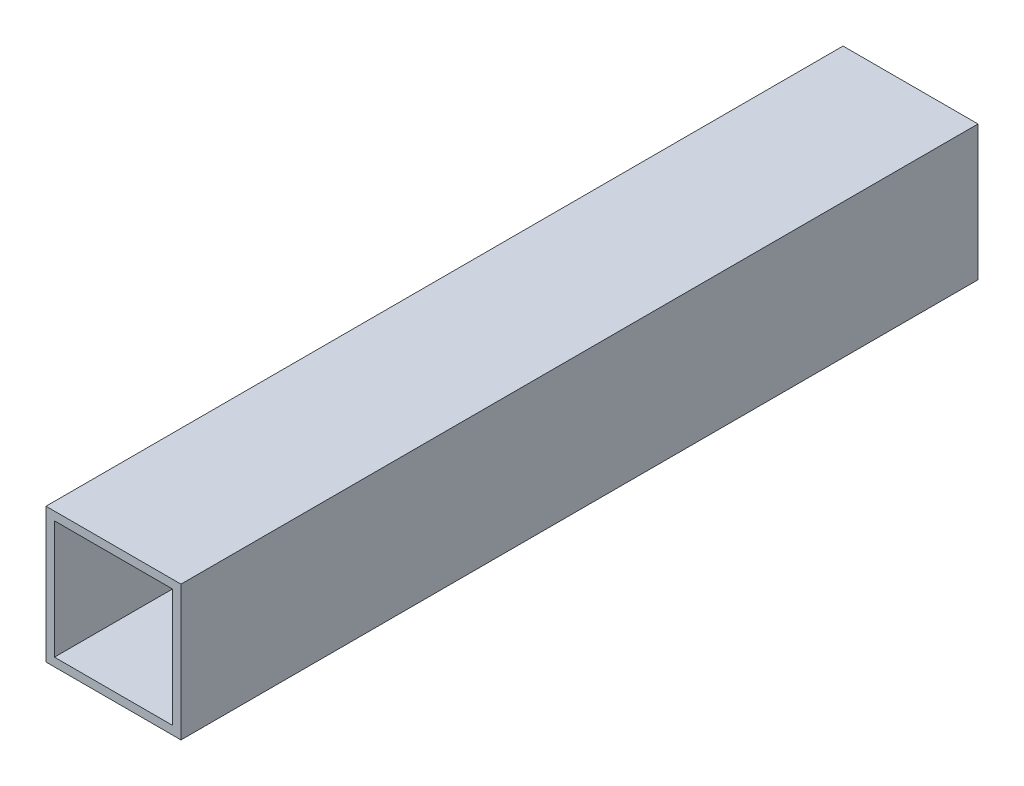
ISO-10303-21;
HEADER;
FILE_DESCRIPTION(('STEP AP214'),'2;1');
FILE_NAME('part.step','',(''),(''),'','','');
FILE_SCHEMA(('AUTOMOTIVE_DESIGN { 1 0 10303 214 1 1 1 1 }'));
ENDSEC;
DATA;
#1=APPLICATION_CONTEXT('core data for automotive mechanical design processes');
#2=APPLICATION_PROTOCOL_DEFINITION('international standard','automotive_design',2000,#1);
#3=PRODUCT_CONTEXT('',#1,'mechanical');
#4=PRODUCT('Part','Part','',(#3));
#5=PRODUCT_RELATED_PRODUCT_CATEGORY('part','',(#4));
#6=PRODUCT_DEFINITION_FORMATION('','',#4);
#7=PRODUCT_DEFINITION_CONTEXT('part definition',#1,'design');
#8=PRODUCT_DEFINITION('design','',#6,#7);
#9=PRODUCT_DEFINITION_SHAPE('','',#8);
#10=(LENGTH_UNIT() NAMED_UNIT(*) SI_UNIT(.MILLI.,.METRE.));
#11=(NAMED_UNIT(*) PLANE_ANGLE_UNIT() SI_UNIT($,.RADIAN.));
#12=(NAMED_UNIT(*) SI_UNIT($,.STERADIAN.) SOLID_ANGLE_UNIT());
#13=UNCERTAINTY_MEASURE_WITH_UNIT(LENGTH_MEASURE(1.E-05),#10,'distance_accuracy_value','');
#14=(GEOMETRIC_REPRESENTATION_CONTEXT(3) GLOBAL_UNCERTAINTY_ASSIGNED_CONTEXT((#13)) GLOBAL_UNIT_ASSIGNED_CONTEXT((#10,
#11,#12)) REPRESENTATION_CONTEXT('',''));
#15=CARTESIAN_POINT('',(0.,0.,0.));
#16=DIRECTION('',(0.,0.,1.));
#17=DIRECTION('',(1.,0.,0.));
#18=AXIS2_PLACEMENT_3D('',#15,#16,#17);
#19=CARTESIAN_POINT('',(0.,0.,75.));
#20=DIRECTION('',(0.,0.,1.));
#21=DIRECTION('',(1.,0.,0.));
#22=AXIS2_PLACEMENT_3D('',#19,#20,#21);
#23=PLANE('',#22);
#24=DIRECTION('',(0.,-1.,0.));
#25=VECTOR('',#24,1.);
#26=CARTESIAN_POINT('',(-12.7,-12.7,75.));
#27=LINE('',#26,#25);
#28=CARTESIAN_POINT('',(-12.7,12.7,75.));
#29=VERTEX_POINT('',#28);
#30=CARTESIAN_POINT('',(-12.7,-12.7,75.));
#31=VERTEX_POINT('',#30);
#32=EDGE_CURVE('E137',#29,#31,#27,.T.);
#33=ORIENTED_EDGE('',*,*,#32,.T.);
#34=DIRECTION('',(1.,0.,0.));
#35=VECTOR('',#34,1.);
#36=CARTESIAN_POINT('',(12.7,-12.7,75.));
#37=LINE('',#36,#35);
#38=CARTESIAN_POINT('',(12.7,-12.7,75.));
#39=VERTEX_POINT('',#38);
#40=EDGE_CURVE('E140',#31,#39,#37,.T.);
#41=ORIENTED_EDGE('',*,*,#40,.T.);
#42=DIRECTION('',(0.,1.,0.));
#43=VECTOR('',#42,1.);
#44=CARTESIAN_POINT('',(12.7,-12.7,75.));
#45=LINE('',#44,#43);
#46=CARTESIAN_POINT('',(12.7,12.7,75.));
#47=VERTEX_POINT('',#46);
#48=EDGE_CURVE('E143',#39,#47,#45,.T.);
#49=ORIENTED_EDGE('',*,*,#48,.T.);
#50=DIRECTION('',(-1.,0.,0.));
#51=VECTOR('',#50,1.);
#52=CARTESIAN_POINT('',(12.7,12.7,75.));
#53=LINE('',#52,#51);
#54=EDGE_CURVE('E145',#47,#29,#53,.T.);
#55=ORIENTED_EDGE('',*,*,#54,.T.);
#56=EDGE_LOOP('',(#33,#41,#49,#55));
#57=FACE_BOUND('',#56,.T.);
#58=DIRECTION('',(1.,0.,0.));
#59=VECTOR('',#58,1.);
#60=CARTESIAN_POINT('',(11.1125,-11.1125,75.));
#61=LINE('',#60,#59);
#62=CARTESIAN_POINT('',(-11.1125,-11.1125,75.));
#63=VERTEX_POINT('',#62);
#64=CARTESIAN_POINT('',(11.1125,-11.1125,75.));
#65=VERTEX_POINT('',#64);
#66=EDGE_CURVE('E109',#63,#65,#61,.T.);
#67=ORIENTED_EDGE('',*,*,#66,.F.);
#68=DIRECTION('',(0.,-1.,0.));
#69=VECTOR('',#68,1.);
#70=CARTESIAN_POINT('',(-11.1125,-11.1125,75.));
#71=LINE('',#70,#69);
#72=CARTESIAN_POINT('',(-11.1125,11.1125,75.));
#73=VERTEX_POINT('',#72);
#74=EDGE_CURVE('E101',#73,#63,#71,.T.);
#75=ORIENTED_EDGE('',*,*,#74,.F.);
#76=DIRECTION('',(-1.,0.,0.));
#77=VECTOR('',#76,1.);
#78=CARTESIAN_POINT('',(11.1125,11.1125,75.));
#79=LINE('',#78,#77);
#80=CARTESIAN_POINT('',(11.1125,11.1125,75.));
#81=VERTEX_POINT('',#80);
#82=EDGE_CURVE('E123',#81,#73,#79,.T.);
#83=ORIENTED_EDGE('',*,*,#82,.F.);
#84=DIRECTION('',(0.,1.,0.));
#85=VECTOR('',#84,1.);
#86=CARTESIAN_POINT('',(11.1125,-11.1125,75.));
#87=LINE('',#86,#85);
#88=EDGE_CURVE('E121',#65,#81,#87,.T.);
#89=ORIENTED_EDGE('',*,*,#88,.F.);
#90=EDGE_LOOP('',(#67,#75,#83,#89));
#91=FACE_BOUND('',#90,.T.);
#92=ADVANCED_FACE('F36',(#57,#91),#23,.T.);
#93=CARTESIAN_POINT('',(0.,0.,-75.));
#94=DIRECTION('',(0.,0.,1.));
#95=DIRECTION('',(1.,0.,0.));
#96=AXIS2_PLACEMENT_3D('',#93,#94,#95);
#97=PLANE('',#96);
#98=DIRECTION('',(0.,-1.,0.));
#99=VECTOR('',#98,1.);
#100=CARTESIAN_POINT('',(-12.7,-12.7,-75.));
#101=LINE('',#100,#99);
#102=CARTESIAN_POINT('',(-12.7,12.7,-75.));
#103=VERTEX_POINT('',#102);
#104=CARTESIAN_POINT('',(-12.7,-12.7,-75.));
#105=VERTEX_POINT('',#104);
#106=EDGE_CURVE('E117',#103,#105,#101,.T.);
#107=ORIENTED_EDGE('',*,*,#106,.F.);
#108=DIRECTION('',(-1.,0.,0.));
#109=VECTOR('',#108,1.);
#110=CARTESIAN_POINT('',(12.7,12.7,-75.));
#111=LINE('',#110,#109);
#112=CARTESIAN_POINT('',(12.7,12.7,-75.));
#113=VERTEX_POINT('',#112);
#114=EDGE_CURVE('E141',#113,#103,#111,.T.);
#115=ORIENTED_EDGE('',*,*,#114,.F.);
#116=DIRECTION('',(0.,1.,0.));
#117=VECTOR('',#116,1.);
#118=CARTESIAN_POINT('',(12.7,-12.7,-75.));
#119=LINE('',#118,#117);
#120=CARTESIAN_POINT('',(12.7,-12.7,-75.));
#121=VERTEX_POINT('',#120);
#122=EDGE_CURVE('E152',#121,#113,#119,.T.);
#123=ORIENTED_EDGE('',*,*,#122,.F.);
#124=DIRECTION('',(1.,0.,0.));
#125=VECTOR('',#124,1.);
#126=CARTESIAN_POINT('',(12.7,-12.7,-75.));
#127=LINE('',#126,#125);
#128=EDGE_CURVE('E150',#105,#121,#127,.T.);
#129=ORIENTED_EDGE('',*,*,#128,.F.);
#130=EDGE_LOOP('',(#107,#115,#123,#129));
#131=FACE_BOUND('',#130,.T.);
#132=DIRECTION('',(0.,-1.,0.));
#133=VECTOR('',#132,1.);
#134=CARTESIAN_POINT('',(-11.1125,-11.1125,-75.));
#135=LINE('',#134,#133);
#136=CARTESIAN_POINT('',(-11.1125,11.1125,-75.));
#137=VERTEX_POINT('',#136);
#138=CARTESIAN_POINT('',(-11.1125,-11.1125,-75.));
#139=VERTEX_POINT('',#138);
#140=EDGE_CURVE('E59',#137,#139,#135,.T.);
#141=ORIENTED_EDGE('',*,*,#140,.T.);
#142=DIRECTION('',(1.,0.,0.));
#143=VECTOR('',#142,1.);
#144=CARTESIAN_POINT('',(11.1125,-11.1125,-75.));
#145=LINE('',#144,#143);
#146=CARTESIAN_POINT('',(11.1125,-11.1125,-75.));
#147=VERTEX_POINT('',#146);
#148=EDGE_CURVE('E116',#139,#147,#145,.T.);
#149=ORIENTED_EDGE('',*,*,#148,.T.);
#150=DIRECTION('',(0.,1.,0.));
#151=VECTOR('',#150,1.);
#152=CARTESIAN_POINT('',(11.1125,-11.1125,-75.));
#153=LINE('',#152,#151);
#154=CARTESIAN_POINT('',(11.1125,11.1125,-75.));
#155=VERTEX_POINT('',#154);
#156=EDGE_CURVE('E129',#147,#155,#153,.T.);
#157=ORIENTED_EDGE('',*,*,#156,.T.);
#158=DIRECTION('',(-1.,0.,0.));
#159=VECTOR('',#158,1.);
#160=CARTESIAN_POINT('',(11.1125,11.1125,-75.));
#161=LINE('',#160,#159);
#162=EDGE_CURVE('E110',#155,#137,#161,.T.);
#163=ORIENTED_EDGE('',*,*,#162,.T.);
#164=EDGE_LOOP('',(#141,#149,#157,#163));
#165=FACE_BOUND('',#164,.T.);
#166=ADVANCED_FACE('F170',(#131,#165),#97,.F.);
#167=CARTESIAN_POINT('',(-12.7,-12.7,75.));
#168=DIRECTION('',(1.,0.,0.));
#169=DIRECTION('',(0.,0.,-1.));
#170=AXIS2_PLACEMENT_3D('',#167,#168,#169);
#171=PLANE('',#170);
#172=ORIENTED_EDGE('',*,*,#106,.T.);
#173=DIRECTION('',(0.,0.,-1.));
#174=VECTOR('',#173,1.);
#175=CARTESIAN_POINT('',(-12.7,-12.7,75.));
#176=LINE('',#175,#174);
#177=EDGE_CURVE('E11',#31,#105,#176,.T.);
#178=ORIENTED_EDGE('',*,*,#177,.F.);
#179=ORIENTED_EDGE('',*,*,#32,.F.);
#180=DIRECTION('',(0.,0.,-1.));
#181=VECTOR('',#180,1.);
#182=CARTESIAN_POINT('',(-12.7,12.7,75.));
#183=LINE('',#182,#181);
#184=EDGE_CURVE('E147',#29,#103,#183,.T.);
#185=ORIENTED_EDGE('',*,*,#184,.T.);
#186=EDGE_LOOP('',(#172,#178,#179,#185));
#187=FACE_BOUND('',#186,.T.);
#188=ADVANCED_FACE('F38',(#187),#171,.F.);
#189=CARTESIAN_POINT('',(12.7,-12.7,75.));
#190=DIRECTION('',(0.,1.,0.));
#191=DIRECTION('',(0.,0.,1.));
#192=AXIS2_PLACEMENT_3D('',#189,#190,#191);
#193=PLANE('',#192);
#194=ORIENTED_EDGE('',*,*,#128,.T.);
#195=DIRECTION('',(0.,0.,-1.));
#196=VECTOR('',#195,1.);
#197=CARTESIAN_POINT('',(12.7,-12.7,75.));
#198=LINE('',#197,#196);
#199=EDGE_CURVE('E44',#39,#121,#198,.T.);
#200=ORIENTED_EDGE('',*,*,#199,.F.);
#201=ORIENTED_EDGE('',*,*,#40,.F.);
#202=ORIENTED_EDGE('',*,*,#177,.T.);
#203=EDGE_LOOP('',(#194,#200,#201,#202));
#204=FACE_BOUND('',#203,.T.);
#205=ADVANCED_FACE('F180',(#204),#193,.F.);
#206=CARTESIAN_POINT('',(12.7,-12.7,75.));
#207=DIRECTION('',(-1.,0.,0.));
#208=DIRECTION('',(0.,-1.,0.));
#209=AXIS2_PLACEMENT_3D('',#206,#207,#208);
#210=PLANE('',#209);
#211=ORIENTED_EDGE('',*,*,#122,.T.);
#212=DIRECTION('',(0.,0.,-1.));
#213=VECTOR('',#212,1.);
#214=CARTESIAN_POINT('',(12.7,12.7,75.));
#215=LINE('',#214,#213);
#216=EDGE_CURVE('E157',#47,#113,#215,.T.);
#217=ORIENTED_EDGE('',*,*,#216,.F.);
#218=ORIENTED_EDGE('',*,*,#48,.F.);
#219=ORIENTED_EDGE('',*,*,#199,.T.);
#220=EDGE_LOOP('',(#211,#217,#218,#219));
#221=FACE_BOUND('',#220,.T.);
#222=ADVANCED_FACE('F164',(#221),#210,.F.);
#223=CARTESIAN_POINT('',(12.7,12.7,75.));
#224=DIRECTION('',(0.,-1.,0.));
#225=DIRECTION('',(0.,0.,-1.));
#226=AXIS2_PLACEMENT_3D('',#223,#224,#225);
#227=PLANE('',#226);
#228=ORIENTED_EDGE('',*,*,#114,.T.);
#229=ORIENTED_EDGE('',*,*,#184,.F.);
#230=ORIENTED_EDGE('',*,*,#54,.F.);
#231=ORIENTED_EDGE('',*,*,#216,.T.);
#232=EDGE_LOOP('',(#228,#229,#230,#231));
#233=FACE_BOUND('',#232,.T.);
#234=ADVANCED_FACE('F174',(#233),#227,.F.);
#235=CARTESIAN_POINT('',(-11.1125,-11.1125,75.));
#236=DIRECTION('',(1.,0.,0.));
#237=DIRECTION('',(0.,0.,-1.));
#238=AXIS2_PLACEMENT_3D('',#235,#236,#237);
#239=PLANE('',#238);
#240=ORIENTED_EDGE('',*,*,#140,.F.);
#241=DIRECTION('',(0.,0.,-1.));
#242=VECTOR('',#241,1.);
#243=CARTESIAN_POINT('',(-11.1125,11.1125,75.));
#244=LINE('',#243,#242);
#245=EDGE_CURVE('E105',#73,#137,#244,.T.);
#246=ORIENTED_EDGE('',*,*,#245,.F.);
#247=ORIENTED_EDGE('',*,*,#74,.T.);
#248=DIRECTION('',(0.,0.,-1.));
#249=VECTOR('',#248,1.);
#250=CARTESIAN_POINT('',(-11.1125,-11.1125,75.));
#251=LINE('',#250,#249);
#252=EDGE_CURVE('E104',#63,#139,#251,.T.);
#253=ORIENTED_EDGE('',*,*,#252,.T.);
#254=EDGE_LOOP('',(#240,#246,#247,#253));
#255=FACE_BOUND('',#254,.T.);
#256=ADVANCED_FACE('F103',(#255),#239,.T.);
#257=CARTESIAN_POINT('',(11.1125,-11.1125,75.));
#258=DIRECTION('',(0.,1.,0.));
#259=DIRECTION('',(0.,0.,1.));
#260=AXIS2_PLACEMENT_3D('',#257,#258,#259);
#261=PLANE('',#260);
#262=ORIENTED_EDGE('',*,*,#148,.F.);
#263=ORIENTED_EDGE('',*,*,#252,.F.);
#264=ORIENTED_EDGE('',*,*,#66,.T.);
#265=DIRECTION('',(0.,0.,-1.));
#266=VECTOR('',#265,1.);
#267=CARTESIAN_POINT('',(11.1125,-11.1125,75.));
#268=LINE('',#267,#266);
#269=EDGE_CURVE('E118',#65,#147,#268,.T.);
#270=ORIENTED_EDGE('',*,*,#269,.T.);
#271=EDGE_LOOP('',(#262,#263,#264,#270));
#272=FACE_BOUND('',#271,.T.);
#273=ADVANCED_FACE('F113',(#272),#261,.T.);
#274=CARTESIAN_POINT('',(11.1125,-11.1125,75.));
#275=DIRECTION('',(-1.,0.,0.));
#276=DIRECTION('',(0.,-1.,0.));
#277=AXIS2_PLACEMENT_3D('',#274,#275,#276);
#278=PLANE('',#277);
#279=ORIENTED_EDGE('',*,*,#156,.F.);
#280=ORIENTED_EDGE('',*,*,#269,.F.);
#281=ORIENTED_EDGE('',*,*,#88,.T.);
#282=DIRECTION('',(0.,0.,-1.));
#283=VECTOR('',#282,1.);
#284=CARTESIAN_POINT('',(11.1125,11.1125,75.));
#285=LINE('',#284,#283);
#286=EDGE_CURVE('E51',#81,#155,#285,.T.);
#287=ORIENTED_EDGE('',*,*,#286,.T.);
#288=EDGE_LOOP('',(#279,#280,#281,#287));
#289=FACE_BOUND('',#288,.T.);
#290=ADVANCED_FACE('F203',(#289),#278,.T.);
#291=CARTESIAN_POINT('',(11.1125,11.1125,75.));
#292=DIRECTION('',(0.,-1.,0.));
#293=DIRECTION('',(0.,0.,-1.));
#294=AXIS2_PLACEMENT_3D('',#291,#292,#293);
#295=PLANE('',#294);
#296=ORIENTED_EDGE('',*,*,#162,.F.);
#297=ORIENTED_EDGE('',*,*,#286,.F.);
#298=ORIENTED_EDGE('',*,*,#82,.T.);
#299=ORIENTED_EDGE('',*,*,#245,.T.);
#300=EDGE_LOOP('',(#296,#297,#298,#299));
#301=FACE_BOUND('',#300,.T.);
#302=ADVANCED_FACE('F207',(#301),#295,.T.);
#303=CLOSED_SHELL('',(#92,#166,#188,#205,#222,#234,#256,#273,#290,#302));
#304=MANIFOLD_SOLID_BREP('B2',#303);
#305=ADVANCED_BREP_SHAPE_REPRESENTATION('',(#18,#304),#14);
#306=SHAPE_DEFINITION_REPRESENTATION(#9,#305);
ENDSEC;
END-ISO-10303-21;
